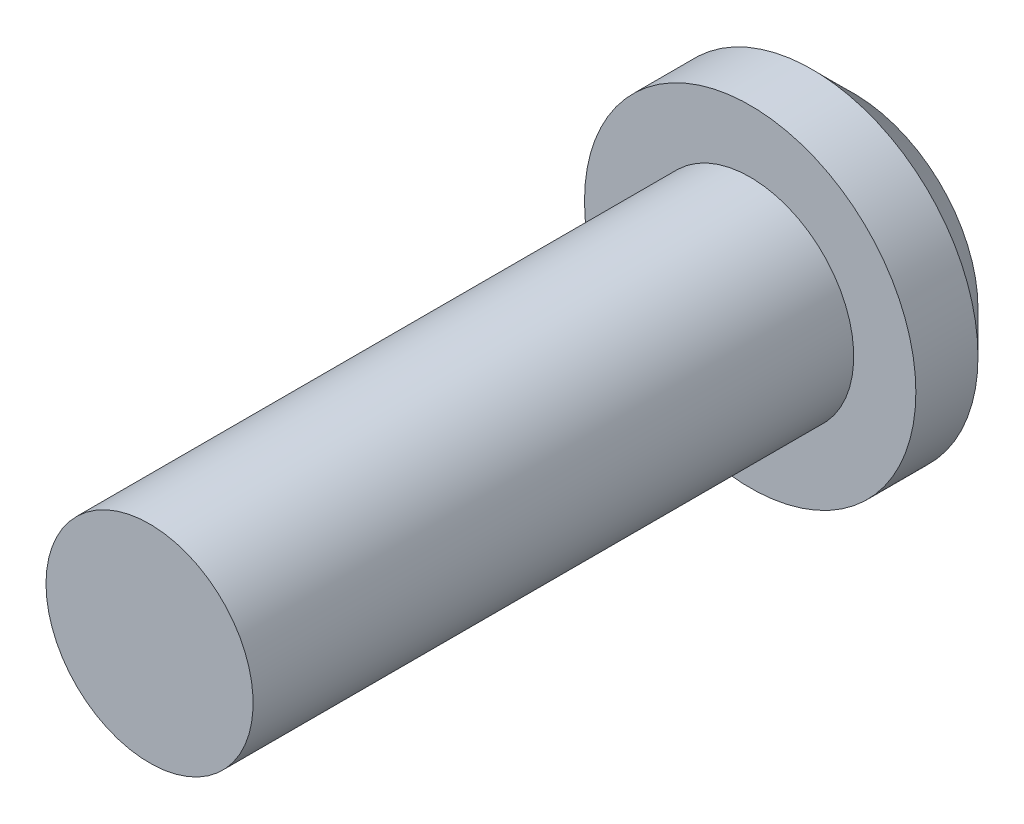
ISO-10303-21;
HEADER;
FILE_DESCRIPTION(('STEP AP214'),'2;1');
FILE_NAME('part.step','',(''),(''),'','','');
FILE_SCHEMA(('AUTOMOTIVE_DESIGN { 1 0 10303 214 1 1 1 1 }'));
ENDSEC;
DATA;
#1=APPLICATION_CONTEXT('core data for automotive mechanical design processes');
#2=APPLICATION_PROTOCOL_DEFINITION('international standard','automotive_design',2000,#1);
#3=PRODUCT_CONTEXT('',#1,'mechanical');
#4=PRODUCT('Part','Part','',(#3));
#5=PRODUCT_RELATED_PRODUCT_CATEGORY('part','',(#4));
#6=PRODUCT_DEFINITION_FORMATION('','',#4);
#7=PRODUCT_DEFINITION_CONTEXT('part definition',#1,'design');
#8=PRODUCT_DEFINITION('design','',#6,#7);
#9=PRODUCT_DEFINITION_SHAPE('','',#8);
#10=(LENGTH_UNIT() NAMED_UNIT(*) SI_UNIT(.MILLI.,.METRE.));
#11=(NAMED_UNIT(*) PLANE_ANGLE_UNIT() SI_UNIT($,.RADIAN.));
#12=(NAMED_UNIT(*) SI_UNIT($,.STERADIAN.) SOLID_ANGLE_UNIT());
#13=UNCERTAINTY_MEASURE_WITH_UNIT(LENGTH_MEASURE(1.E-05),#10,'distance_accuracy_value','');
#14=(GEOMETRIC_REPRESENTATION_CONTEXT(3) GLOBAL_UNCERTAINTY_ASSIGNED_CONTEXT((#13)) GLOBAL_UNIT_ASSIGNED_CONTEXT((#10,
#11,#12)) REPRESENTATION_CONTEXT('',''));
#15=CARTESIAN_POINT('',(0.,0.,0.));
#16=DIRECTION('',(0.,0.,1.));
#17=DIRECTION('',(1.,0.,0.));
#18=AXIS2_PLACEMENT_3D('',#15,#16,#17);
#19=CARTESIAN_POINT('',(0.,0.,2.5));
#20=DIRECTION('',(0.,0.,-1.));
#21=DIRECTION('',(-1.,0.,0.));
#22=AXIS2_PLACEMENT_3D('',#19,#20,#21);
#23=CYLINDRICAL_SURFACE('',#22,4.);
#24=CARTESIAN_POINT('',(0.,0.,0.999999999999996));
#25=DIRECTION('',(0.,0.,1.));
#26=DIRECTION('',(1.,0.,0.));
#27=AXIS2_PLACEMENT_3D('',#24,#25,#26);
#28=CIRCLE('',#27,4.);
#29=CARTESIAN_POINT('',(4.,0.,0.999999999999996));
#30=VERTEX_POINT('',#29);
#31=EDGE_CURVE('E50',#30,#30,#28,.T.);
#32=ORIENTED_EDGE('',*,*,#31,.T.);
#33=EDGE_LOOP('',(#32));
#34=FACE_BOUND('',#33,.T.);
#35=CARTESIAN_POINT('',(0.,0.,2.5));
#36=DIRECTION('',(0.,0.,1.));
#37=DIRECTION('',(1.,0.,0.));
#38=AXIS2_PLACEMENT_3D('',#35,#36,#37);
#39=CIRCLE('',#38,4.);
#40=CARTESIAN_POINT('',(4.,0.,2.5));
#41=VERTEX_POINT('',#40);
#42=EDGE_CURVE('E152',#41,#41,#39,.T.);
#43=ORIENTED_EDGE('',*,*,#42,.F.);
#44=EDGE_LOOP('',(#43));
#45=FACE_BOUND('',#44,.T.);
#46=ADVANCED_FACE('F41',(#34,#45),#23,.T.);
#47=CARTESIAN_POINT('',(0.,0.,2.5));
#48=DIRECTION('',(0.,0.,1.));
#49=DIRECTION('',(1.,0.,0.));
#50=AXIS2_PLACEMENT_3D('',#47,#48,#49);
#51=PLANE('',#50);
#52=CARTESIAN_POINT('',(0.,0.,2.5));
#53=DIRECTION('',(0.,0.,1.));
#54=DIRECTION('',(1.,0.,0.));
#55=AXIS2_PLACEMENT_3D('',#52,#53,#54);
#56=CIRCLE('',#55,2.5);
#57=CARTESIAN_POINT('',(-2.5,0.,2.5));
#58=VERTEX_POINT('',#57);
#59=EDGE_CURVE('E153',#58,#58,#56,.T.);
#60=ORIENTED_EDGE('',*,*,#59,.F.);
#61=EDGE_LOOP('',(#60));
#62=FACE_BOUND('',#61,.T.);
#63=ORIENTED_EDGE('',*,*,#42,.T.);
#64=EDGE_LOOP('',(#63));
#65=FACE_BOUND('',#64,.T.);
#66=ADVANCED_FACE('F177',(#62,#65),#51,.T.);
#67=CARTESIAN_POINT('',(0.,0.,0.));
#68=DIRECTION('',(0.,0.,1.));
#69=DIRECTION('',(1.,0.,0.));
#70=AXIS2_PLACEMENT_3D('',#67,#68,#69);
#71=PLANE('',#70);
#72=DIRECTION('',(0.681091282940255,-0.73219851427246,0.));
#73=VECTOR('',#72,1.);
#74=CARTESIAN_POINT('',(0.870420923579916,2.83444762293969,0.));
#75=LINE('',#74,#73);
#76=CARTESIAN_POINT('',(0.870420923579916,2.83444762293969,0.));
#77=VERTEX_POINT('',#76);
#78=CARTESIAN_POINT('',(2.88991410895215,0.663417179664128,0.));
#79=VERTEX_POINT('',#78);
#80=EDGE_CURVE('E131',#77,#79,#75,.T.);
#81=ORIENTED_EDGE('',*,*,#80,.F.);
#82=DIRECTION('',(0.974648155443301,0.223743096186166,0.));
#83=VECTOR('',#82,1.);
#84=CARTESIAN_POINT('',(-2.01949318537223,2.17103044327557,0.));
#85=LINE('',#84,#83);
#86=CARTESIAN_POINT('',(-2.01949318537223,2.17103044327557,0.));
#87=VERTEX_POINT('',#86);
#88=EDGE_CURVE('E57',#87,#77,#85,.T.);
#89=ORIENTED_EDGE('',*,*,#88,.F.);
#90=DIRECTION('',(0.293556872503045,0.955941610458626,0.));
#91=VECTOR('',#90,1.);
#92=CARTESIAN_POINT('',(-2.88991410895215,-0.663417179664128,0.));
#93=LINE('',#92,#91);
#94=CARTESIAN_POINT('',(-2.88991410895215,-0.663417179664128,0.));
#95=VERTEX_POINT('',#94);
#96=EDGE_CURVE('E140',#95,#87,#93,.T.);
#97=ORIENTED_EDGE('',*,*,#96,.F.);
#98=DIRECTION('',(-0.681091282940255,0.73219851427246,0.));
#99=VECTOR('',#98,1.);
#100=CARTESIAN_POINT('',(-0.870420923579915,-2.83444762293969,0.));
#101=LINE('',#100,#99);
#102=CARTESIAN_POINT('',(-0.870420923579915,-2.83444762293969,0.));
#103=VERTEX_POINT('',#102);
#104=EDGE_CURVE('E138',#103,#95,#101,.T.);
#105=ORIENTED_EDGE('',*,*,#104,.F.);
#106=DIRECTION('',(-0.9746481554433,-0.223743096186166,0.));
#107=VECTOR('',#106,1.);
#108=CARTESIAN_POINT('',(2.01949318537223,-2.17103044327557,0.));
#109=LINE('',#108,#107);
#110=CARTESIAN_POINT('',(2.01949318537223,-2.17103044327557,0.));
#111=VERTEX_POINT('',#110);
#112=EDGE_CURVE('E105',#111,#103,#109,.T.);
#113=ORIENTED_EDGE('',*,*,#112,.F.);
#114=DIRECTION('',(-0.293556872503045,-0.955941610458626,0.));
#115=VECTOR('',#114,1.);
#116=CARTESIAN_POINT('',(2.88991410895215,0.663417179664128,0.));
#117=LINE('',#116,#115);
#118=EDGE_CURVE('E134',#79,#111,#117,.T.);
#119=ORIENTED_EDGE('',*,*,#118,.F.);
#120=EDGE_LOOP('',(#81,#89,#97,#105,#113,#119));
#121=FACE_BOUND('',#120,.T.);
#122=CARTESIAN_POINT('',(0.,0.,0.));
#123=DIRECTION('',(0.,0.,1.));
#124=DIRECTION('',(1.,0.,0.));
#125=AXIS2_PLACEMENT_3D('',#122,#123,#124);
#126=CIRCLE('',#125,3.);
#127=CARTESIAN_POINT('',(3.,0.,0.));
#128=VERTEX_POINT('',#127);
#129=EDGE_CURVE('E11',#128,#128,#126,.F.);
#130=ORIENTED_EDGE('',*,*,#129,.T.);
#131=EDGE_LOOP('',(#130));
#132=FACE_BOUND('',#131,.T.);
#133=ADVANCED_FACE('F181',(#121,#132),#71,.F.);
#134=CARTESIAN_POINT('',(0.,0.,17.));
#135=DIRECTION('',(0.,0.,-1.));
#136=DIRECTION('',(-1.,0.,0.));
#137=AXIS2_PLACEMENT_3D('',#134,#135,#136);
#138=CYLINDRICAL_SURFACE('',#137,2.5);
#139=CARTESIAN_POINT('',(0.,0.,17.));
#140=DIRECTION('',(0.,0.,1.));
#141=DIRECTION('',(1.,0.,0.));
#142=AXIS2_PLACEMENT_3D('',#139,#140,#141);
#143=CIRCLE('',#142,2.5);
#144=CARTESIAN_POINT('',(-2.5,0.,17.));
#145=VERTEX_POINT('',#144);
#146=EDGE_CURVE('E144',#145,#145,#143,.T.);
#147=CARTESIAN_POINT('',(-2.5,0.,17.));
#148=CARTESIAN_POINT('',(-2.5,0.,16.8489583333333));
#149=CARTESIAN_POINT('',(-2.5,0.,16.6979166666667));
#150=CARTESIAN_POINT('',(-2.5,0.,16.3958333333333));
#151=CARTESIAN_POINT('',(-2.5,0.,16.2447916666667));
#152=CARTESIAN_POINT('',(-2.5,0.,15.9427083333333));
#153=CARTESIAN_POINT('',(-2.5,0.,15.7916666666667));
#154=CARTESIAN_POINT('',(-2.5,0.,15.4895833333333));
#155=CARTESIAN_POINT('',(-2.5,0.,15.3385416666667));
#156=CARTESIAN_POINT('',(-2.5,0.,15.0364583333333));
#157=CARTESIAN_POINT('',(-2.5,0.,14.8854166666667));
#158=CARTESIAN_POINT('',(-2.5,0.,14.5833333333333));
#159=CARTESIAN_POINT('',(-2.5,0.,14.4322916666667));
#160=CARTESIAN_POINT('',(-2.5,0.,14.1302083333333));
#161=CARTESIAN_POINT('',(-2.5,0.,13.9791666666667));
#162=CARTESIAN_POINT('',(-2.5,0.,13.6770833333333));
#163=CARTESIAN_POINT('',(-2.5,0.,13.5260416666667));
#164=CARTESIAN_POINT('',(-2.5,0.,13.2239583333333));
#165=CARTESIAN_POINT('',(-2.5,0.,13.0729166666667));
#166=CARTESIAN_POINT('',(-2.5,0.,12.7708333333333));
#167=CARTESIAN_POINT('',(-2.5,0.,12.6197916666667));
#168=CARTESIAN_POINT('',(-2.5,0.,12.3177083333333));
#169=CARTESIAN_POINT('',(-2.5,0.,12.1666666666667));
#170=CARTESIAN_POINT('',(-2.5,0.,11.8645833333333));
#171=CARTESIAN_POINT('',(-2.5,0.,11.7135416666667));
#172=CARTESIAN_POINT('',(-2.5,0.,11.4114583333333));
#173=CARTESIAN_POINT('',(-2.5,0.,11.2604166666667));
#174=CARTESIAN_POINT('',(-2.5,0.,10.9583333333333));
#175=CARTESIAN_POINT('',(-2.5,0.,10.8072916666667));
#176=CARTESIAN_POINT('',(-2.5,0.,10.5052083333333));
#177=CARTESIAN_POINT('',(-2.5,0.,10.3541666666667));
#178=CARTESIAN_POINT('',(-2.5,0.,10.0520833333333));
#179=CARTESIAN_POINT('',(-2.5,0.,9.90104166666667));
#180=CARTESIAN_POINT('',(-2.5,0.,9.59895833333333));
#181=CARTESIAN_POINT('',(-2.5,0.,9.44791666666667));
#182=CARTESIAN_POINT('',(-2.5,0.,9.14583333333333));
#183=CARTESIAN_POINT('',(-2.5,0.,8.99479166666667));
#184=CARTESIAN_POINT('',(-2.5,0.,8.69270833333333));
#185=CARTESIAN_POINT('',(-2.5,0.,8.54166666666667));
#186=CARTESIAN_POINT('',(-2.5,0.,8.23958333333333));
#187=CARTESIAN_POINT('',(-2.5,0.,8.08854166666667));
#188=CARTESIAN_POINT('',(-2.5,0.,7.78645833333333));
#189=CARTESIAN_POINT('',(-2.5,0.,7.63541666666667));
#190=CARTESIAN_POINT('',(-2.5,0.,7.33333333333333));
#191=CARTESIAN_POINT('',(-2.5,0.,7.18229166666667));
#192=CARTESIAN_POINT('',(-2.5,0.,6.88020833333333));
#193=CARTESIAN_POINT('',(-2.5,0.,6.72916666666667));
#194=CARTESIAN_POINT('',(-2.5,0.,6.42708333333333));
#195=CARTESIAN_POINT('',(-2.5,0.,6.27604166666667));
#196=CARTESIAN_POINT('',(-2.5,0.,5.97395833333333));
#197=CARTESIAN_POINT('',(-2.5,0.,5.82291666666667));
#198=CARTESIAN_POINT('',(-2.5,0.,5.52083333333333));
#199=CARTESIAN_POINT('',(-2.5,0.,5.36979166666667));
#200=CARTESIAN_POINT('',(-2.5,0.,5.06770833333333));
#201=CARTESIAN_POINT('',(-2.5,0.,4.91666666666667));
#202=CARTESIAN_POINT('',(-2.5,0.,4.61458333333333));
#203=CARTESIAN_POINT('',(-2.5,0.,4.46354166666667));
#204=CARTESIAN_POINT('',(-2.5,0.,4.16145833333333));
#205=CARTESIAN_POINT('',(-2.5,0.,4.01041666666667));
#206=CARTESIAN_POINT('',(-2.5,0.,3.70833333333333));
#207=CARTESIAN_POINT('',(-2.5,0.,3.55729166666667));
#208=CARTESIAN_POINT('',(-2.5,0.,3.25520833333333));
#209=CARTESIAN_POINT('',(-2.5,0.,3.10416666666667));
#210=CARTESIAN_POINT('',(-2.5,0.,2.80208333333333));
#211=CARTESIAN_POINT('',(-2.5,0.,2.65104166666667));
#212=CARTESIAN_POINT('',(-2.5,0.,2.5));
#213=B_SPLINE_CURVE_WITH_KNOTS('',3,(#147,#148,#149,#150,#151,#152,#153,#154,#155,#156,#157,
#158,#159,#160,#161,#162,#163,#164,#165,#166,#167,#168,#169,#170,#171,#172,#173,#174,#175,#176,
#177,#178,#179,#180,#181,#182,#183,#184,#185,#186,#187,#188,#189,#190,#191,#192,#193,#194,#195,
#196,#197,#198,#199,#200,#201,#202,#203,#204,#205,#206,#207,#208,#209,#210,#211,#212),
.UNSPECIFIED.,.F.,.F.,(4,2,2,2,2,2,2,2,2,2,2,2,2,2,2,2,2,2,2,2,2,2,2,2,2,2,2,2,2,2,2,2,4),(0.,
0.453124999999999,0.906249999999997,1.359375,1.8125,2.265625,2.71875,3.171875,3.625,4.078125,
4.53125,4.984375,5.4375,5.890625,6.34375,6.796875,7.25,7.703125,8.15625,8.609375,9.0625,
9.515625,9.96875,10.421875,10.875,11.328125,11.78125,12.234375,12.6875,13.140625,13.59375,
14.046875,14.5),.UNSPECIFIED.);
#214=EDGE_CURVE('BSEAM172',#145,#58,#213,.T.);
#215=ORIENTED_EDGE('',*,*,#146,.F.);
#216=ORIENTED_EDGE('',*,*,#59,.T.);
#217=ORIENTED_EDGE('',*,*,#214,.T.);
#218=ORIENTED_EDGE('',*,*,#214,.F.);
#219=EDGE_LOOP('',(#215,#217,#216,#218));
#220=FACE_BOUND('',#219,.T.);
#221=ADVANCED_FACE('F172',(#220),#138,.T.);
#222=CARTESIAN_POINT('',(0.,0.,17.));
#223=DIRECTION('',(0.,0.,1.));
#224=DIRECTION('',(1.,0.,0.));
#225=AXIS2_PLACEMENT_3D('',#222,#223,#224);
#226=PLANE('',#225);
#227=ORIENTED_EDGE('',*,*,#146,.T.);
#228=EDGE_LOOP('',(#227));
#229=FACE_BOUND('',#228,.T.);
#230=ADVANCED_FACE('F164',(#229),#226,.T.);
#231=CARTESIAN_POINT('',(0.,0.,0.999999999999996));
#232=DIRECTION('',(0.,0.,1.));
#233=DIRECTION('',(1.,0.,0.));
#234=AXIS2_PLACEMENT_3D('',#231,#232,#233);
#235=CONICAL_SURFACE('',#234,4.,0.78539816339745);
#236=ORIENTED_EDGE('',*,*,#129,.F.);
#237=EDGE_LOOP('',(#236));
#238=FACE_BOUND('',#237,.T.);
#239=ORIENTED_EDGE('',*,*,#31,.F.);
#240=EDGE_LOOP('',(#239));
#241=FACE_BOUND('',#240,.T.);
#242=ADVANCED_FACE('F44',(#238,#241),#235,.T.);
#243=CARTESIAN_POINT('',(-2.01949318537223,2.17103044327557,1.5));
#244=DIRECTION('',(-0.223743096186166,0.974648155443301,0.));
#245=DIRECTION('',(-0.974648155443301,-0.223743096186166,0.));
#246=AXIS2_PLACEMENT_3D('',#243,#244,#245);
#247=PLANE('',#246);
#248=ORIENTED_EDGE('',*,*,#88,.T.);
#249=DIRECTION('',(0.,0.,-1.));
#250=VECTOR('',#249,1.);
#251=CARTESIAN_POINT('',(0.870420923579916,2.83444762293969,1.5));
#252=LINE('',#251,#250);
#253=CARTESIAN_POINT('',(0.870420923579916,2.83444762293969,1.5));
#254=VERTEX_POINT('',#253);
#255=EDGE_CURVE('E87',#254,#77,#252,.T.);
#256=ORIENTED_EDGE('',*,*,#255,.F.);
#257=DIRECTION('',(0.974648155443301,0.223743096186166,0.));
#258=VECTOR('',#257,1.);
#259=CARTESIAN_POINT('',(-2.01949318537223,2.17103044327557,1.5));
#260=LINE('',#259,#258);
#261=CARTESIAN_POINT('',(-2.01949318537223,2.17103044327557,1.5));
#262=VERTEX_POINT('',#261);
#263=EDGE_CURVE('E142',#262,#254,#260,.T.);
#264=ORIENTED_EDGE('',*,*,#263,.F.);
#265=DIRECTION('',(0.,0.,-1.));
#266=VECTOR('',#265,1.);
#267=CARTESIAN_POINT('',(-2.01949318537223,2.17103044327557,1.5));
#268=LINE('',#267,#266);
#269=EDGE_CURVE('E65',#262,#87,#268,.T.);
#270=ORIENTED_EDGE('',*,*,#269,.T.);
#271=EDGE_LOOP('',(#248,#256,#264,#270));
#272=FACE_BOUND('',#271,.T.);
#273=ADVANCED_FACE('F163',(#272),#247,.F.);
#274=CARTESIAN_POINT('',(-2.88991410895215,-0.663417179664128,1.5));
#275=DIRECTION('',(-0.955941610458626,0.293556872503045,0.));
#276=DIRECTION('',(-0.293556872503045,-0.955941610458626,0.));
#277=AXIS2_PLACEMENT_3D('',#274,#275,#276);
#278=PLANE('',#277);
#279=ORIENTED_EDGE('',*,*,#96,.T.);
#280=ORIENTED_EDGE('',*,*,#269,.F.);
#281=DIRECTION('',(0.293556872503045,0.955941610458626,0.));
#282=VECTOR('',#281,1.);
#283=CARTESIAN_POINT('',(-2.88991410895215,-0.663417179664128,1.5));
#284=LINE('',#283,#282);
#285=CARTESIAN_POINT('',(-2.88991410895215,-0.663417179664128,1.5));
#286=VERTEX_POINT('',#285);
#287=EDGE_CURVE('E117',#286,#262,#284,.T.);
#288=ORIENTED_EDGE('',*,*,#287,.F.);
#289=DIRECTION('',(0.,0.,-1.));
#290=VECTOR('',#289,1.);
#291=CARTESIAN_POINT('',(-2.88991410895215,-0.663417179664128,1.5));
#292=LINE('',#291,#290);
#293=EDGE_CURVE('E109',#286,#95,#292,.T.);
#294=ORIENTED_EDGE('',*,*,#293,.T.);
#295=EDGE_LOOP('',(#279,#280,#288,#294));
#296=FACE_BOUND('',#295,.T.);
#297=ADVANCED_FACE('F170',(#296),#278,.F.);
#298=CARTESIAN_POINT('',(-0.870420923579915,-2.83444762293969,1.5));
#299=DIRECTION('',(-0.73219851427246,-0.681091282940255,0.));
#300=DIRECTION('',(0.681091282940255,-0.73219851427246,0.));
#301=AXIS2_PLACEMENT_3D('',#298,#299,#300);
#302=PLANE('',#301);
#303=ORIENTED_EDGE('',*,*,#104,.T.);
#304=ORIENTED_EDGE('',*,*,#293,.F.);
#305=DIRECTION('',(-0.681091282940255,0.73219851427246,0.));
#306=VECTOR('',#305,1.);
#307=CARTESIAN_POINT('',(-0.870420923579915,-2.83444762293969,1.5));
#308=LINE('',#307,#306);
#309=CARTESIAN_POINT('',(-0.870420923579915,-2.83444762293969,1.5));
#310=VERTEX_POINT('',#309);
#311=EDGE_CURVE('E113',#310,#286,#308,.T.);
#312=ORIENTED_EDGE('',*,*,#311,.F.);
#313=DIRECTION('',(0.,0.,-1.));
#314=VECTOR('',#313,1.);
#315=CARTESIAN_POINT('',(-0.870420923579915,-2.83444762293969,1.5));
#316=LINE('',#315,#314);
#317=EDGE_CURVE('E98',#310,#103,#316,.T.);
#318=ORIENTED_EDGE('',*,*,#317,.T.);
#319=EDGE_LOOP('',(#303,#304,#312,#318));
#320=FACE_BOUND('',#319,.T.);
#321=ADVANCED_FACE('F114',(#320),#302,.F.);
#322=CARTESIAN_POINT('',(2.01949318537223,-2.17103044327557,1.5));
#323=DIRECTION('',(0.223743096186166,-0.9746481554433,0.));
#324=DIRECTION('',(0.9746481554433,0.223743096186166,0.));
#325=AXIS2_PLACEMENT_3D('',#322,#323,#324);
#326=PLANE('',#325);
#327=ORIENTED_EDGE('',*,*,#112,.T.);
#328=ORIENTED_EDGE('',*,*,#317,.F.);
#329=DIRECTION('',(-0.9746481554433,-0.223743096186166,0.));
#330=VECTOR('',#329,1.);
#331=CARTESIAN_POINT('',(2.01949318537223,-2.17103044327557,1.5));
#332=LINE('',#331,#330);
#333=CARTESIAN_POINT('',(2.01949318537223,-2.17103044327557,1.5));
#334=VERTEX_POINT('',#333);
#335=EDGE_CURVE('E102',#334,#310,#332,.T.);
#336=ORIENTED_EDGE('',*,*,#335,.F.);
#337=DIRECTION('',(0.,0.,-1.));
#338=VECTOR('',#337,1.);
#339=CARTESIAN_POINT('',(2.01949318537223,-2.17103044327557,1.5));
#340=LINE('',#339,#338);
#341=EDGE_CURVE('E110',#334,#111,#340,.T.);
#342=ORIENTED_EDGE('',*,*,#341,.T.);
#343=EDGE_LOOP('',(#327,#328,#336,#342));
#344=FACE_BOUND('',#343,.T.);
#345=ADVANCED_FACE('F100',(#344),#326,.F.);
#346=CARTESIAN_POINT('',(2.88991410895215,0.663417179664128,1.5));
#347=DIRECTION('',(0.955941610458626,-0.293556872503045,0.));
#348=DIRECTION('',(0.293556872503045,0.955941610458626,0.));
#349=AXIS2_PLACEMENT_3D('',#346,#347,#348);
#350=PLANE('',#349);
#351=ORIENTED_EDGE('',*,*,#118,.T.);
#352=ORIENTED_EDGE('',*,*,#341,.F.);
#353=DIRECTION('',(-0.293556872503045,-0.955941610458626,0.));
#354=VECTOR('',#353,1.);
#355=CARTESIAN_POINT('',(2.88991410895215,0.663417179664128,1.5));
#356=LINE('',#355,#354);
#357=CARTESIAN_POINT('',(2.88991410895215,0.663417179664128,1.5));
#358=VERTEX_POINT('',#357);
#359=EDGE_CURVE('E123',#358,#334,#356,.T.);
#360=ORIENTED_EDGE('',*,*,#359,.F.);
#361=DIRECTION('',(0.,0.,-1.));
#362=VECTOR('',#361,1.);
#363=CARTESIAN_POINT('',(2.88991410895215,0.663417179664128,1.5));
#364=LINE('',#363,#362);
#365=EDGE_CURVE('E147',#358,#79,#364,.T.);
#366=ORIENTED_EDGE('',*,*,#365,.T.);
#367=EDGE_LOOP('',(#351,#352,#360,#366));
#368=FACE_BOUND('',#367,.T.);
#369=ADVANCED_FACE('F194',(#368),#350,.F.);
#370=CARTESIAN_POINT('',(0.870420923579916,2.83444762293969,1.5));
#371=DIRECTION('',(0.73219851427246,0.681091282940255,0.));
#372=DIRECTION('',(-0.681091282940255,0.73219851427246,0.));
#373=AXIS2_PLACEMENT_3D('',#370,#371,#372);
#374=PLANE('',#373);
#375=ORIENTED_EDGE('',*,*,#80,.T.);
#376=ORIENTED_EDGE('',*,*,#365,.F.);
#377=DIRECTION('',(0.681091282940255,-0.73219851427246,0.));
#378=VECTOR('',#377,1.);
#379=CARTESIAN_POINT('',(0.870420923579916,2.83444762293969,1.5));
#380=LINE('',#379,#378);
#381=EDGE_CURVE('E125',#254,#358,#380,.T.);
#382=ORIENTED_EDGE('',*,*,#381,.F.);
#383=ORIENTED_EDGE('',*,*,#255,.T.);
#384=EDGE_LOOP('',(#375,#376,#382,#383));
#385=FACE_BOUND('',#384,.T.);
#386=ADVANCED_FACE('F191',(#385),#374,.F.);
#387=CARTESIAN_POINT('',(0.,0.,1.5));
#388=DIRECTION('',(0.,0.,-1.));
#389=DIRECTION('',(-1.,0.,0.));
#390=AXIS2_PLACEMENT_3D('',#387,#388,#389);
#391=PLANE('',#390);
#392=ORIENTED_EDGE('',*,*,#263,.T.);
#393=ORIENTED_EDGE('',*,*,#381,.T.);
#394=ORIENTED_EDGE('',*,*,#359,.T.);
#395=ORIENTED_EDGE('',*,*,#335,.T.);
#396=ORIENTED_EDGE('',*,*,#311,.T.);
#397=ORIENTED_EDGE('',*,*,#287,.T.);
#398=EDGE_LOOP('',(#392,#393,#394,#395,#396,#397));
#399=FACE_BOUND('',#398,.T.);
#400=ADVANCED_FACE('F120',(#399),#391,.T.);
#401=CLOSED_SHELL('',(#46,#66,#133,#221,#230,#242,#273,#297,#321,#345,#369,#386,#400));
#402=MANIFOLD_SOLID_BREP('B2',#401);
#403=ADVANCED_BREP_SHAPE_REPRESENTATION('',(#18,#402),#14);
#404=SHAPE_DEFINITION_REPRESENTATION(#9,#403);
ENDSEC;
END-ISO-10303-21;
